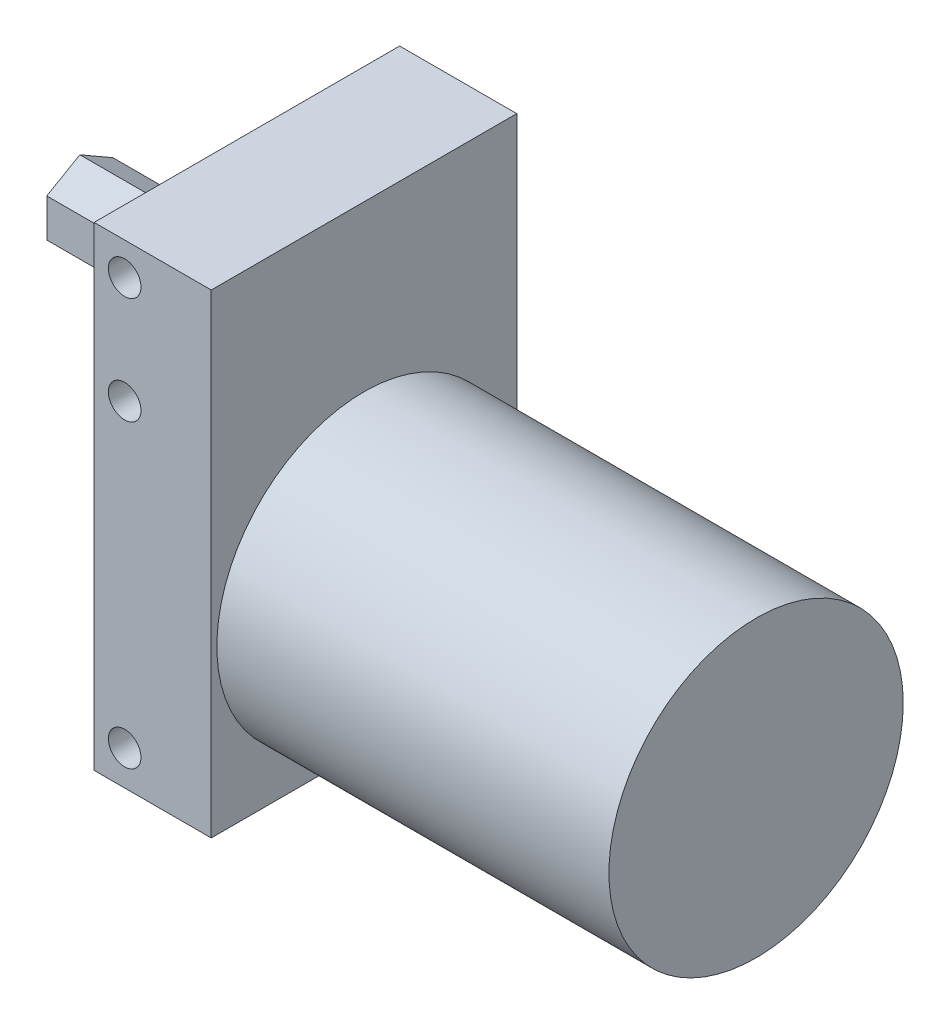
ISO-10303-21;
HEADER;
FILE_DESCRIPTION(('STEP AP214'),'2;1');
FILE_NAME('part.step','',(''),(''),'','','');
FILE_SCHEMA(('AUTOMOTIVE_DESIGN { 1 0 10303 214 1 1 1 1 }'));
ENDSEC;
DATA;
#1=APPLICATION_CONTEXT('core data for automotive mechanical design processes');
#2=APPLICATION_PROTOCOL_DEFINITION('international standard','automotive_design',2000,#1);
#3=PRODUCT_CONTEXT('',#1,'mechanical');
#4=PRODUCT('Part','Part','',(#3));
#5=PRODUCT_RELATED_PRODUCT_CATEGORY('part','',(#4));
#6=PRODUCT_DEFINITION_FORMATION('','',#4);
#7=PRODUCT_DEFINITION_CONTEXT('part definition',#1,'design');
#8=PRODUCT_DEFINITION('design','',#6,#7);
#9=PRODUCT_DEFINITION_SHAPE('','',#8);
#10=(LENGTH_UNIT() NAMED_UNIT(*) SI_UNIT(.MILLI.,.METRE.));
#11=(NAMED_UNIT(*) PLANE_ANGLE_UNIT() SI_UNIT($,.RADIAN.));
#12=(NAMED_UNIT(*) SI_UNIT($,.STERADIAN.) SOLID_ANGLE_UNIT());
#13=UNCERTAINTY_MEASURE_WITH_UNIT(LENGTH_MEASURE(1.E-05),#10,'distance_accuracy_value','');
#14=(GEOMETRIC_REPRESENTATION_CONTEXT(3) GLOBAL_UNCERTAINTY_ASSIGNED_CONTEXT((#13)) GLOBAL_UNIT_ASSIGNED_CONTEXT((#10,
#11,#12)) REPRESENTATION_CONTEXT('',''));
#15=CARTESIAN_POINT('',(0.,0.,0.));
#16=DIRECTION('',(0.,0.,1.));
#17=DIRECTION('',(1.,0.,0.));
#18=AXIS2_PLACEMENT_3D('',#15,#16,#17);
#19=CARTESIAN_POINT('',(-16.4,32.9,-15.));
#20=DIRECTION('',(1.,0.,0.));
#21=DIRECTION('',(0.,0.,-1.));
#22=AXIS2_PLACEMENT_3D('',#19,#20,#21);
#23=CYLINDRICAL_SURFACE('',#22,1.6);
#24=CARTESIAN_POINT('',(-16.4,32.9,-15.));
#25=DIRECTION('',(1.,0.,0.));
#26=DIRECTION('',(0.,0.,-1.));
#27=AXIS2_PLACEMENT_3D('',#24,#25,#26);
#28=CIRCLE('',#27,1.6);
#29=CARTESIAN_POINT('',(-16.4,32.9,-16.6));
#30=VERTEX_POINT('',#29);
#31=EDGE_CURVE('E154',#30,#30,#28,.T.);
#32=ORIENTED_EDGE('',*,*,#31,.F.);
#33=EDGE_LOOP('',(#32));
#34=FACE_BOUND('',#33,.T.);
#35=CARTESIAN_POINT('',(-10.4,32.9,-15.));
#36=DIRECTION('',(1.,0.,0.));
#37=DIRECTION('',(0.,0.,-1.));
#38=AXIS2_PLACEMENT_3D('',#35,#36,#37);
#39=CIRCLE('',#38,1.6);
#40=CARTESIAN_POINT('',(-10.4,32.9,-16.6));
#41=VERTEX_POINT('',#40);
#42=EDGE_CURVE('E47',#41,#41,#39,.F.);
#43=ORIENTED_EDGE('',*,*,#42,.F.);
#44=EDGE_LOOP('',(#43));
#45=FACE_BOUND('',#44,.T.);
#46=ADVANCED_FACE('F43',(#34,#45),#23,.F.);
#47=CARTESIAN_POINT('',(11.5,0.,0.));
#48=DIRECTION('',(0.,1.,0.));
#49=DIRECTION('',(0.,0.,1.));
#50=AXIS2_PLACEMENT_3D('',#47,#48,#49);
#51=PLANE('',#50);
#52=DIRECTION('',(0.,0.,-1.));
#53=VECTOR('',#52,1.);
#54=CARTESIAN_POINT('',(0.,0.,0.));
#55=LINE('',#54,#53);
#56=CARTESIAN_POINT('',(0.,0.,0.));
#57=VERTEX_POINT('',#56);
#58=CARTESIAN_POINT('',(0.,0.,-30.));
#59=VERTEX_POINT('',#58);
#60=EDGE_CURVE('E198',#57,#59,#55,.T.);
#61=ORIENTED_EDGE('',*,*,#60,.T.);
#62=DIRECTION('',(-1.,0.,0.));
#63=VECTOR('',#62,1.);
#64=CARTESIAN_POINT('',(11.5,0.,-30.));
#65=LINE('',#64,#63);
#66=CARTESIAN_POINT('',(11.5,0.,-30.));
#67=VERTEX_POINT('',#66);
#68=EDGE_CURVE('E222',#67,#59,#65,.T.);
#69=ORIENTED_EDGE('',*,*,#68,.F.);
#70=DIRECTION('',(0.,0.,-1.));
#71=VECTOR('',#70,1.);
#72=CARTESIAN_POINT('',(11.5,0.,0.));
#73=LINE('',#72,#71);
#74=CARTESIAN_POINT('',(11.5,0.,0.));
#75=VERTEX_POINT('',#74);
#76=EDGE_CURVE('E201',#75,#67,#73,.T.);
#77=ORIENTED_EDGE('',*,*,#76,.F.);
#78=DIRECTION('',(-1.,0.,0.));
#79=VECTOR('',#78,1.);
#80=CARTESIAN_POINT('',(11.5,0.,0.));
#81=LINE('',#80,#79);
#82=EDGE_CURVE('E61',#75,#57,#81,.T.);
#83=ORIENTED_EDGE('',*,*,#82,.T.);
#84=EDGE_LOOP('',(#61,#69,#77,#83));
#85=FACE_BOUND('',#84,.T.);
#86=ADVANCED_FACE('F45',(#85),#51,.F.);
#87=CARTESIAN_POINT('',(11.5,0.,-30.));
#88=DIRECTION('',(0.,0.,1.));
#89=DIRECTION('',(1.,0.,0.));
#90=AXIS2_PLACEMENT_3D('',#87,#88,#89);
#91=PLANE('',#90);
#92=CARTESIAN_POINT('',(3.2,43.4,-30.));
#93=DIRECTION('',(0.,0.,-1.));
#94=DIRECTION('',(-1.,0.,0.));
#95=AXIS2_PLACEMENT_3D('',#92,#93,#94);
#96=CIRCLE('',#95,1.6);
#97=CARTESIAN_POINT('',(1.6,43.4,-30.));
#98=VERTEX_POINT('',#97);
#99=EDGE_CURVE('E274',#98,#98,#96,.T.);
#100=ORIENTED_EDGE('',*,*,#99,.F.);
#101=EDGE_LOOP('',(#100));
#102=FACE_BOUND('',#101,.T.);
#103=CARTESIAN_POINT('',(3.2,32.9,-30.));
#104=DIRECTION('',(0.,0.,-1.));
#105=DIRECTION('',(-1.,0.,0.));
#106=AXIS2_PLACEMENT_3D('',#103,#104,#105);
#107=CIRCLE('',#106,1.6);
#108=CARTESIAN_POINT('',(1.6,32.9,-30.));
#109=VERTEX_POINT('',#108);
#110=EDGE_CURVE('E278',#109,#109,#107,.T.);
#111=ORIENTED_EDGE('',*,*,#110,.F.);
#112=EDGE_LOOP('',(#111));
#113=FACE_BOUND('',#112,.T.);
#114=CARTESIAN_POINT('',(3.2,3.4,-30.));
#115=DIRECTION('',(0.,0.,-1.));
#116=DIRECTION('',(-1.,0.,0.));
#117=AXIS2_PLACEMENT_3D('',#114,#115,#116);
#118=CIRCLE('',#117,1.6);
#119=CARTESIAN_POINT('',(1.6,3.4,-30.));
#120=VERTEX_POINT('',#119);
#121=EDGE_CURVE('E281',#120,#120,#118,.T.);
#122=ORIENTED_EDGE('',*,*,#121,.F.);
#123=EDGE_LOOP('',(#122));
#124=FACE_BOUND('',#123,.T.);
#125=DIRECTION('',(0.,1.,0.));
#126=VECTOR('',#125,1.);
#127=CARTESIAN_POINT('',(0.,0.,-30.));
#128=LINE('',#127,#126);
#129=CARTESIAN_POINT('',(0.,46.6,-30.));
#130=VERTEX_POINT('',#129);
#131=EDGE_CURVE('E211',#59,#130,#128,.T.);
#132=ORIENTED_EDGE('',*,*,#131,.T.);
#133=DIRECTION('',(-1.,0.,0.));
#134=VECTOR('',#133,1.);
#135=CARTESIAN_POINT('',(11.5,46.6,-30.));
#136=LINE('',#135,#134);
#137=CARTESIAN_POINT('',(11.5,46.6,-30.));
#138=VERTEX_POINT('',#137);
#139=EDGE_CURVE('E221',#138,#130,#136,.T.);
#140=ORIENTED_EDGE('',*,*,#139,.F.);
#141=DIRECTION('',(0.,1.,0.));
#142=VECTOR('',#141,1.);
#143=CARTESIAN_POINT('',(11.5,0.,-30.));
#144=LINE('',#143,#142);
#145=EDGE_CURVE('E88',#67,#138,#144,.T.);
#146=ORIENTED_EDGE('',*,*,#145,.F.);
#147=ORIENTED_EDGE('',*,*,#68,.T.);
#148=EDGE_LOOP('',(#132,#140,#146,#147));
#149=FACE_BOUND('',#148,.T.);
#150=ADVANCED_FACE('F237',(#102,#113,#124,#149),#91,.F.);
#151=CARTESIAN_POINT('',(11.5,46.6,0.));
#152=DIRECTION('',(0.,1.,0.));
#153=DIRECTION('',(0.,0.,1.));
#154=AXIS2_PLACEMENT_3D('',#151,#152,#153);
#155=PLANE('',#154);
#156=DIRECTION('',(0.,0.,-1.));
#157=VECTOR('',#156,1.);
#158=CARTESIAN_POINT('',(0.,46.6,0.));
#159=LINE('',#158,#157);
#160=CARTESIAN_POINT('',(0.,46.6,0.));
#161=VERTEX_POINT('',#160);
#162=EDGE_CURVE('E214',#161,#130,#159,.T.);
#163=ORIENTED_EDGE('',*,*,#162,.F.);
#164=DIRECTION('',(-1.,0.,0.));
#165=VECTOR('',#164,1.);
#166=CARTESIAN_POINT('',(11.5,46.6,0.));
#167=LINE('',#166,#165);
#168=CARTESIAN_POINT('',(11.5,46.6,0.));
#169=VERTEX_POINT('',#168);
#170=EDGE_CURVE('E76',#169,#161,#167,.T.);
#171=ORIENTED_EDGE('',*,*,#170,.F.);
#172=DIRECTION('',(0.,0.,-1.));
#173=VECTOR('',#172,1.);
#174=CARTESIAN_POINT('',(11.5,46.6,0.));
#175=LINE('',#174,#173);
#176=EDGE_CURVE('E205',#169,#138,#175,.T.);
#177=ORIENTED_EDGE('',*,*,#176,.T.);
#178=ORIENTED_EDGE('',*,*,#139,.T.);
#179=EDGE_LOOP('',(#163,#171,#177,#178));
#180=FACE_BOUND('',#179,.T.);
#181=ADVANCED_FACE('F261',(#180),#155,.T.);
#182=CARTESIAN_POINT('',(11.5,0.,0.));
#183=DIRECTION('',(0.,0.,1.));
#184=DIRECTION('',(1.,0.,0.));
#185=AXIS2_PLACEMENT_3D('',#182,#183,#184);
#186=PLANE('',#185);
#187=CARTESIAN_POINT('',(3.,43.4,0.));
#188=DIRECTION('',(0.,0.,1.));
#189=DIRECTION('',(1.,0.,0.));
#190=AXIS2_PLACEMENT_3D('',#187,#188,#189);
#191=CIRCLE('',#190,1.6);
#192=CARTESIAN_POINT('',(4.6,43.4,0.));
#193=VERTEX_POINT('',#192);
#194=EDGE_CURVE('E299',#193,#193,#191,.T.);
#195=ORIENTED_EDGE('',*,*,#194,.F.);
#196=EDGE_LOOP('',(#195));
#197=FACE_BOUND('',#196,.T.);
#198=CARTESIAN_POINT('',(3.,32.9,0.));
#199=DIRECTION('',(0.,0.,1.));
#200=DIRECTION('',(1.,0.,0.));
#201=AXIS2_PLACEMENT_3D('',#198,#199,#200);
#202=CIRCLE('',#201,1.6);
#203=CARTESIAN_POINT('',(4.6,32.9,0.));
#204=VERTEX_POINT('',#203);
#205=EDGE_CURVE('E302',#204,#204,#202,.T.);
#206=ORIENTED_EDGE('',*,*,#205,.F.);
#207=EDGE_LOOP('',(#206));
#208=FACE_BOUND('',#207,.T.);
#209=CARTESIAN_POINT('',(3.,3.4,0.));
#210=DIRECTION('',(0.,0.,1.));
#211=DIRECTION('',(1.,0.,0.));
#212=AXIS2_PLACEMENT_3D('',#209,#210,#211);
#213=CIRCLE('',#212,1.6);
#214=CARTESIAN_POINT('',(4.6,3.4,0.));
#215=VERTEX_POINT('',#214);
#216=EDGE_CURVE('E308',#215,#215,#213,.T.);
#217=ORIENTED_EDGE('',*,*,#216,.F.);
#218=EDGE_LOOP('',(#217));
#219=FACE_BOUND('',#218,.T.);
#220=DIRECTION('',(0.,1.,0.));
#221=VECTOR('',#220,1.);
#222=CARTESIAN_POINT('',(0.,0.,0.));
#223=LINE('',#222,#221);
#224=EDGE_CURVE('E203',#57,#161,#223,.T.);
#225=ORIENTED_EDGE('',*,*,#224,.F.);
#226=ORIENTED_EDGE('',*,*,#82,.F.);
#227=DIRECTION('',(0.,1.,0.));
#228=VECTOR('',#227,1.);
#229=CARTESIAN_POINT('',(11.5,0.,0.));
#230=LINE('',#229,#228);
#231=EDGE_CURVE('E208',#75,#169,#230,.T.);
#232=ORIENTED_EDGE('',*,*,#231,.T.);
#233=ORIENTED_EDGE('',*,*,#170,.T.);
#234=EDGE_LOOP('',(#225,#226,#232,#233));
#235=FACE_BOUND('',#234,.T.);
#236=ADVANCED_FACE('F254',(#197,#208,#219,#235),#186,.T.);
#237=CARTESIAN_POINT('',(11.5,0.,0.));
#238=DIRECTION('',(1.,0.,0.));
#239=DIRECTION('',(0.,0.,-1.));
#240=AXIS2_PLACEMENT_3D('',#237,#238,#239);
#241=PLANE('',#240);
#242=CARTESIAN_POINT('',(11.5,16.,-15.));
#243=DIRECTION('',(1.,0.,0.));
#244=DIRECTION('',(0.,0.,-1.));
#245=AXIS2_PLACEMENT_3D('',#242,#243,#244);
#246=CIRCLE('',#245,14.45);
#247=CARTESIAN_POINT('',(11.5,16.,-29.45));
#248=VERTEX_POINT('',#247);
#249=EDGE_CURVE('E11',#248,#248,#246,.T.);
#250=ORIENTED_EDGE('',*,*,#249,.F.);
#251=EDGE_LOOP('',(#250));
#252=FACE_BOUND('',#251,.T.);
#253=ORIENTED_EDGE('',*,*,#76,.T.);
#254=ORIENTED_EDGE('',*,*,#145,.T.);
#255=ORIENTED_EDGE('',*,*,#176,.F.);
#256=ORIENTED_EDGE('',*,*,#231,.F.);
#257=EDGE_LOOP('',(#253,#254,#255,#256));
#258=FACE_BOUND('',#257,.T.);
#259=ADVANCED_FACE('F251',(#252,#258),#241,.T.);
#260=CARTESIAN_POINT('',(0.,0.,0.));
#261=DIRECTION('',(1.,0.,0.));
#262=DIRECTION('',(0.,0.,-1.));
#263=AXIS2_PLACEMENT_3D('',#260,#261,#262);
#264=PLANE('',#263);
#265=CARTESIAN_POINT('',(0.,32.9,-15.));
#266=DIRECTION('',(1.,0.,0.));
#267=DIRECTION('',(0.,0.,-1.));
#268=AXIS2_PLACEMENT_3D('',#265,#266,#267);
#269=CIRCLE('',#268,7.);
#270=CARTESIAN_POINT('',(0.,32.9,-22.));
#271=VERTEX_POINT('',#270);
#272=EDGE_CURVE('E169',#271,#271,#269,.T.);
#273=ORIENTED_EDGE('',*,*,#272,.T.);
#274=EDGE_LOOP('',(#273));
#275=FACE_BOUND('',#274,.T.);
#276=ORIENTED_EDGE('',*,*,#60,.F.);
#277=ORIENTED_EDGE('',*,*,#224,.T.);
#278=ORIENTED_EDGE('',*,*,#162,.T.);
#279=ORIENTED_EDGE('',*,*,#131,.F.);
#280=EDGE_LOOP('',(#276,#277,#278,#279));
#281=FACE_BOUND('',#280,.T.);
#282=ADVANCED_FACE('F249',(#275,#281),#264,.F.);
#283=CARTESIAN_POINT('',(-2.5,32.9,-15.));
#284=DIRECTION('',(1.,0.,0.));
#285=DIRECTION('',(0.,0.,-1.));
#286=AXIS2_PLACEMENT_3D('',#283,#284,#285);
#287=CYLINDRICAL_SURFACE('',#286,7.);
#288=CARTESIAN_POINT('',(-2.5,32.9,-15.));
#289=DIRECTION('',(1.,0.,0.));
#290=DIRECTION('',(0.,0.,-1.));
#291=AXIS2_PLACEMENT_3D('',#288,#289,#290);
#292=CIRCLE('',#291,7.);
#293=CARTESIAN_POINT('',(-2.5,32.9,-22.));
#294=VERTEX_POINT('',#293);
#295=EDGE_CURVE('E195',#294,#294,#292,.T.);
#296=ORIENTED_EDGE('',*,*,#295,.T.);
#297=EDGE_LOOP('',(#296));
#298=FACE_BOUND('',#297,.T.);
#299=ORIENTED_EDGE('',*,*,#272,.F.);
#300=EDGE_LOOP('',(#299));
#301=FACE_BOUND('',#300,.T.);
#302=ADVANCED_FACE('F245',(#298,#301),#287,.T.);
#303=CARTESIAN_POINT('',(-2.5,0.,0.));
#304=DIRECTION('',(1.,0.,0.));
#305=DIRECTION('',(0.,0.,-1.));
#306=AXIS2_PLACEMENT_3D('',#303,#304,#305);
#307=PLANE('',#306);
#308=DIRECTION('',(0.,1.,0.));
#309=VECTOR('',#308,1.);
#310=CARTESIAN_POINT('',(-2.5,0.,-18.25));
#311=LINE('',#310,#309);
#312=CARTESIAN_POINT('',(-2.5,31.0236116251337,-18.25));
#313=VERTEX_POINT('',#312);
#314=CARTESIAN_POINT('',(-2.5,34.7763883748663,-18.25));
#315=VERTEX_POINT('',#314);
#316=EDGE_CURVE('E133',#313,#315,#311,.T.);
#317=ORIENTED_EDGE('',*,*,#316,.T.);
#318=DIRECTION('',(0.,0.5,0.866025403784438));
#319=VECTOR('',#318,1.);
#320=CARTESIAN_POINT('',(-2.5,33.9847730906827,-19.621117892254));
#321=LINE('',#320,#319);
#322=CARTESIAN_POINT('',(-2.5,36.6527767497326,-15.));
#323=VERTEX_POINT('',#322);
#324=EDGE_CURVE('E192',#315,#323,#321,.T.);
#325=ORIENTED_EDGE('',*,*,#324,.T.);
#326=DIRECTION('',(0.,-0.500000000000001,0.866025403784438));
#327=VECTOR('',#326,1.);
#328=CARTESIAN_POINT('',(-2.5,20.9943920339161,12.121117892254));
#329=LINE('',#328,#327);
#330=CARTESIAN_POINT('',(-2.5,34.7763883748663,-11.75));
#331=VERTEX_POINT('',#330);
#332=EDGE_CURVE('E189',#323,#331,#329,.T.);
#333=ORIENTED_EDGE('',*,*,#332,.T.);
#334=DIRECTION('',(0.,-1.,0.));
#335=VECTOR('',#334,1.);
#336=CARTESIAN_POINT('',(-2.5,0.,-11.75));
#337=LINE('',#336,#335);
#338=CARTESIAN_POINT('',(-2.5,31.0236116251337,-11.75));
#339=VERTEX_POINT('',#338);
#340=EDGE_CURVE('E186',#331,#339,#337,.T.);
#341=ORIENTED_EDGE('',*,*,#340,.T.);
#342=DIRECTION('',(0.,-0.5,-0.866025403784439));
#343=VECTOR('',#342,1.);
#344=CARTESIAN_POINT('',(-2.5,28.3556079660839,-16.371117892254));
#345=LINE('',#344,#343);
#346=CARTESIAN_POINT('',(-2.5,29.1472232502674,-15.));
#347=VERTEX_POINT('',#346);
#348=EDGE_CURVE('E183',#339,#347,#345,.T.);
#349=ORIENTED_EDGE('',*,*,#348,.T.);
#350=DIRECTION('',(0.,0.5,-0.866025403784438));
#351=VECTOR('',#350,1.);
#352=CARTESIAN_POINT('',(-2.5,15.3652269093173,8.87111789225402));
#353=LINE('',#352,#351);
#354=EDGE_CURVE('E181',#347,#313,#353,.T.);
#355=ORIENTED_EDGE('',*,*,#354,.T.);
#356=EDGE_LOOP('',(#317,#325,#333,#341,#349,#355));
#357=FACE_BOUND('',#356,.T.);
#358=ORIENTED_EDGE('',*,*,#295,.F.);
#359=EDGE_LOOP('',(#358));
#360=FACE_BOUND('',#359,.T.);
#361=ADVANCED_FACE('F242',(#357,#360),#307,.F.);
#362=CARTESIAN_POINT('',(-16.4,15.3652269093173,8.87111789225402));
#363=DIRECTION('',(0.,-0.866025403784438,-0.5));
#364=DIRECTION('',(0.,0.5,-0.866025403784438));
#365=AXIS2_PLACEMENT_3D('',#362,#363,#364);
#366=PLANE('',#365);
#367=ORIENTED_EDGE('',*,*,#354,.F.);
#368=DIRECTION('',(1.,0.,0.));
#369=VECTOR('',#368,1.);
#370=CARTESIAN_POINT('',(-16.4,29.1472232502674,-15.));
#371=LINE('',#370,#369);
#372=CARTESIAN_POINT('',(-16.4,29.1472232502674,-15.));
#373=VERTEX_POINT('',#372);
#374=EDGE_CURVE('E153',#373,#347,#371,.T.);
#375=ORIENTED_EDGE('',*,*,#374,.F.);
#376=DIRECTION('',(0.,0.5,-0.866025403784438));
#377=VECTOR('',#376,1.);
#378=CARTESIAN_POINT('',(-16.4,15.3652269093173,8.87111789225402));
#379=LINE('',#378,#377);
#380=CARTESIAN_POINT('',(-16.4,31.0236116251337,-18.25));
#381=VERTEX_POINT('',#380);
#382=EDGE_CURVE('E145',#373,#381,#379,.T.);
#383=ORIENTED_EDGE('',*,*,#382,.T.);
#384=DIRECTION('',(1.,0.,0.));
#385=VECTOR('',#384,1.);
#386=CARTESIAN_POINT('',(-16.4,31.0236116251337,-18.25));
#387=LINE('',#386,#385);
#388=EDGE_CURVE('E128',#381,#313,#387,.T.);
#389=ORIENTED_EDGE('',*,*,#388,.T.);
#390=EDGE_LOOP('',(#367,#375,#383,#389));
#391=FACE_BOUND('',#390,.T.);
#392=ADVANCED_FACE('F151',(#391),#366,.T.);
#393=CARTESIAN_POINT('',(-16.4,28.3556079660839,-16.371117892254));
#394=DIRECTION('',(0.,-0.866025403784439,0.5));
#395=DIRECTION('',(0.,-0.5,-0.866025403784439));
#396=AXIS2_PLACEMENT_3D('',#393,#394,#395);
#397=PLANE('',#396);
#398=ORIENTED_EDGE('',*,*,#348,.F.);
#399=DIRECTION('',(1.,0.,0.));
#400=VECTOR('',#399,1.);
#401=CARTESIAN_POINT('',(-16.4,31.0236116251337,-11.75));
#402=LINE('',#401,#400);
#403=CARTESIAN_POINT('',(-16.4,31.0236116251337,-11.75));
#404=VERTEX_POINT('',#403);
#405=EDGE_CURVE('E170',#404,#339,#402,.T.);
#406=ORIENTED_EDGE('',*,*,#405,.F.);
#407=DIRECTION('',(0.,-0.5,-0.866025403784439));
#408=VECTOR('',#407,1.);
#409=CARTESIAN_POINT('',(-16.4,28.3556079660839,-16.371117892254));
#410=LINE('',#409,#408);
#411=EDGE_CURVE('E138',#404,#373,#410,.T.);
#412=ORIENTED_EDGE('',*,*,#411,.T.);
#413=ORIENTED_EDGE('',*,*,#374,.T.);
#414=EDGE_LOOP('',(#398,#406,#412,#413));
#415=FACE_BOUND('',#414,.T.);
#416=ADVANCED_FACE('F335',(#415),#397,.T.);
#417=CARTESIAN_POINT('',(-16.4,0.,-11.75));
#418=DIRECTION('',(0.,0.,1.));
#419=DIRECTION('',(1.,0.,0.));
#420=AXIS2_PLACEMENT_3D('',#417,#418,#419);
#421=PLANE('',#420);
#422=ORIENTED_EDGE('',*,*,#340,.F.);
#423=DIRECTION('',(1.,0.,0.));
#424=VECTOR('',#423,1.);
#425=CARTESIAN_POINT('',(-16.4,34.7763883748663,-11.75));
#426=LINE('',#425,#424);
#427=CARTESIAN_POINT('',(-16.4,34.7763883748663,-11.75));
#428=VERTEX_POINT('',#427);
#429=EDGE_CURVE('E173',#428,#331,#426,.T.);
#430=ORIENTED_EDGE('',*,*,#429,.F.);
#431=DIRECTION('',(0.,-1.,0.));
#432=VECTOR('',#431,1.);
#433=CARTESIAN_POINT('',(-16.4,0.,-11.75));
#434=LINE('',#433,#432);
#435=EDGE_CURVE('E164',#428,#404,#434,.T.);
#436=ORIENTED_EDGE('',*,*,#435,.T.);
#437=ORIENTED_EDGE('',*,*,#405,.T.);
#438=EDGE_LOOP('',(#422,#430,#436,#437));
#439=FACE_BOUND('',#438,.T.);
#440=ADVANCED_FACE('F338',(#439),#421,.T.);
#441=CARTESIAN_POINT('',(-16.4,20.9943920339161,12.121117892254));
#442=DIRECTION('',(0.,0.866025403784438,0.500000000000001));
#443=DIRECTION('',(0.,-0.500000000000001,0.866025403784438));
#444=AXIS2_PLACEMENT_3D('',#441,#442,#443);
#445=PLANE('',#444);
#446=ORIENTED_EDGE('',*,*,#332,.F.);
#447=DIRECTION('',(1.,0.,0.));
#448=VECTOR('',#447,1.);
#449=CARTESIAN_POINT('',(-16.4,36.6527767497326,-15.));
#450=LINE('',#449,#448);
#451=CARTESIAN_POINT('',(-16.4,36.6527767497326,-15.));
#452=VERTEX_POINT('',#451);
#453=EDGE_CURVE('E176',#452,#323,#450,.T.);
#454=ORIENTED_EDGE('',*,*,#453,.F.);
#455=DIRECTION('',(0.,-0.500000000000001,0.866025403784438));
#456=VECTOR('',#455,1.);
#457=CARTESIAN_POINT('',(-16.4,20.9943920339161,12.121117892254));
#458=LINE('',#457,#456);
#459=EDGE_CURVE('E161',#452,#428,#458,.T.);
#460=ORIENTED_EDGE('',*,*,#459,.T.);
#461=ORIENTED_EDGE('',*,*,#429,.T.);
#462=EDGE_LOOP('',(#446,#454,#460,#461));
#463=FACE_BOUND('',#462,.T.);
#464=ADVANCED_FACE('F342',(#463),#445,.T.);
#465=CARTESIAN_POINT('',(-16.4,33.9847730906827,-19.621117892254));
#466=DIRECTION('',(0.,0.866025403784438,-0.5));
#467=DIRECTION('',(0.,0.5,0.866025403784438));
#468=AXIS2_PLACEMENT_3D('',#465,#466,#467);
#469=PLANE('',#468);
#470=ORIENTED_EDGE('',*,*,#324,.F.);
#471=DIRECTION('',(1.,0.,0.));
#472=VECTOR('',#471,1.);
#473=CARTESIAN_POINT('',(-16.4,34.7763883748663,-18.25));
#474=LINE('',#473,#472);
#475=CARTESIAN_POINT('',(-16.4,34.7763883748663,-18.25));
#476=VERTEX_POINT('',#475);
#477=EDGE_CURVE('E137',#476,#315,#474,.T.);
#478=ORIENTED_EDGE('',*,*,#477,.F.);
#479=DIRECTION('',(0.,0.5,0.866025403784438));
#480=VECTOR('',#479,1.);
#481=CARTESIAN_POINT('',(-16.4,33.9847730906827,-19.621117892254));
#482=LINE('',#481,#480);
#483=EDGE_CURVE('E149',#476,#452,#482,.T.);
#484=ORIENTED_EDGE('',*,*,#483,.T.);
#485=ORIENTED_EDGE('',*,*,#453,.T.);
#486=EDGE_LOOP('',(#470,#478,#484,#485));
#487=FACE_BOUND('',#486,.T.);
#488=ADVANCED_FACE('F346',(#487),#469,.T.);
#489=CARTESIAN_POINT('',(-16.4,0.,-18.25));
#490=DIRECTION('',(0.,0.,-1.));
#491=DIRECTION('',(-1.,0.,0.));
#492=AXIS2_PLACEMENT_3D('',#489,#490,#491);
#493=PLANE('',#492);
#494=ORIENTED_EDGE('',*,*,#316,.F.);
#495=ORIENTED_EDGE('',*,*,#388,.F.);
#496=DIRECTION('',(0.,1.,0.));
#497=VECTOR('',#496,1.);
#498=CARTESIAN_POINT('',(-16.4,0.,-18.25));
#499=LINE('',#498,#497);
#500=EDGE_CURVE('E131',#381,#476,#499,.T.);
#501=ORIENTED_EDGE('',*,*,#500,.T.);
#502=ORIENTED_EDGE('',*,*,#477,.T.);
#503=EDGE_LOOP('',(#494,#495,#501,#502));
#504=FACE_BOUND('',#503,.T.);
#505=ADVANCED_FACE('F130',(#504),#493,.T.);
#506=CARTESIAN_POINT('',(-16.4,0.,0.));
#507=DIRECTION('',(1.,0.,0.));
#508=DIRECTION('',(0.,0.,-1.));
#509=AXIS2_PLACEMENT_3D('',#506,#507,#508);
#510=PLANE('',#509);
#511=ORIENTED_EDGE('',*,*,#31,.T.);
#512=EDGE_LOOP('',(#511));
#513=FACE_BOUND('',#512,.T.);
#514=ORIENTED_EDGE('',*,*,#382,.F.);
#515=ORIENTED_EDGE('',*,*,#411,.F.);
#516=ORIENTED_EDGE('',*,*,#435,.F.);
#517=ORIENTED_EDGE('',*,*,#459,.F.);
#518=ORIENTED_EDGE('',*,*,#483,.F.);
#519=ORIENTED_EDGE('',*,*,#500,.F.);
#520=EDGE_LOOP('',(#514,#515,#516,#517,#518,#519));
#521=FACE_BOUND('',#520,.T.);
#522=ADVANCED_FACE('F143',(#513,#521),#510,.F.);
#523=CARTESIAN_POINT('',(-10.4,0.,0.));
#524=DIRECTION('',(1.,0.,0.));
#525=DIRECTION('',(0.,0.,-1.));
#526=AXIS2_PLACEMENT_3D('',#523,#524,#525);
#527=PLANE('',#526);
#528=ORIENTED_EDGE('',*,*,#42,.T.);
#529=EDGE_LOOP('',(#528));
#530=FACE_BOUND('',#529,.T.);
#531=ADVANCED_FACE('F227',(#530),#527,.F.);
#532=CARTESIAN_POINT('',(50.,16.,-15.));
#533=DIRECTION('',(-1.,0.,0.));
#534=DIRECTION('',(0.,0.,1.));
#535=AXIS2_PLACEMENT_3D('',#532,#533,#534);
#536=CYLINDRICAL_SURFACE('',#535,14.45);
#537=CARTESIAN_POINT('',(50.,16.,-15.));
#538=DIRECTION('',(1.,0.,0.));
#539=DIRECTION('',(0.,0.,-1.));
#540=AXIS2_PLACEMENT_3D('',#537,#538,#539);
#541=CIRCLE('',#540,14.45);
#542=CARTESIAN_POINT('',(50.,16.,-29.45));
#543=VERTEX_POINT('',#542);
#544=EDGE_CURVE('E157',#543,#543,#541,.T.);
#545=ORIENTED_EDGE('',*,*,#544,.F.);
#546=EDGE_LOOP('',(#545));
#547=FACE_BOUND('',#546,.T.);
#548=ORIENTED_EDGE('',*,*,#249,.T.);
#549=EDGE_LOOP('',(#548));
#550=FACE_BOUND('',#549,.T.);
#551=ADVANCED_FACE('F320',(#547,#550),#536,.T.);
#552=CARTESIAN_POINT('',(50.,16.,-15.));
#553=DIRECTION('',(1.,0.,0.));
#554=DIRECTION('',(0.,0.,-1.));
#555=AXIS2_PLACEMENT_3D('',#552,#553,#554);
#556=PLANE('',#555);
#557=ORIENTED_EDGE('',*,*,#544,.T.);
#558=EDGE_LOOP('',(#557));
#559=FACE_BOUND('',#558,.T.);
#560=ADVANCED_FACE('F318',(#559),#556,.T.);
#561=CARTESIAN_POINT('',(3.,3.4,-6.));
#562=DIRECTION('',(0.,0.,1.));
#563=DIRECTION('',(1.,0.,0.));
#564=AXIS2_PLACEMENT_3D('',#561,#562,#563);
#565=CYLINDRICAL_SURFACE('',#564,1.6);
#566=CARTESIAN_POINT('',(3.,3.4,-6.));
#567=DIRECTION('',(0.,0.,1.));
#568=DIRECTION('',(1.,0.,0.));
#569=AXIS2_PLACEMENT_3D('',#566,#567,#568);
#570=CIRCLE('',#569,1.6);
#571=CARTESIAN_POINT('',(4.6,3.4,-6.));
#572=VERTEX_POINT('',#571);
#573=EDGE_CURVE('E311',#572,#572,#570,.T.);
#574=ORIENTED_EDGE('',*,*,#573,.F.);
#575=EDGE_LOOP('',(#574));
#576=FACE_BOUND('',#575,.T.);
#577=ORIENTED_EDGE('',*,*,#216,.T.);
#578=EDGE_LOOP('',(#577));
#579=FACE_BOUND('',#578,.T.);
#580=ADVANCED_FACE('F328',(#576,#579),#565,.F.);
#581=CARTESIAN_POINT('',(3.,3.4,-6.));
#582=DIRECTION('',(0.,0.,1.));
#583=DIRECTION('',(1.,0.,0.));
#584=AXIS2_PLACEMENT_3D('',#581,#582,#583);
#585=PLANE('',#584);
#586=ORIENTED_EDGE('',*,*,#573,.T.);
#587=EDGE_LOOP('',(#586));
#588=FACE_BOUND('',#587,.T.);
#589=ADVANCED_FACE('F390',(#588),#585,.T.);
#590=CARTESIAN_POINT('',(3.,32.9,-6.));
#591=DIRECTION('',(0.,0.,1.));
#592=DIRECTION('',(1.,0.,0.));
#593=AXIS2_PLACEMENT_3D('',#590,#591,#592);
#594=CYLINDRICAL_SURFACE('',#593,1.6);
#595=CARTESIAN_POINT('',(3.,32.9,-6.));
#596=DIRECTION('',(0.,0.,1.));
#597=DIRECTION('',(1.,0.,0.));
#598=AXIS2_PLACEMENT_3D('',#595,#596,#597);
#599=CIRCLE('',#598,1.6);
#600=CARTESIAN_POINT('',(4.6,32.9,-6.));
#601=VERTEX_POINT('',#600);
#602=EDGE_CURVE('E305',#601,#601,#599,.T.);
#603=ORIENTED_EDGE('',*,*,#602,.F.);
#604=EDGE_LOOP('',(#603));
#605=FACE_BOUND('',#604,.T.);
#606=ORIENTED_EDGE('',*,*,#205,.T.);
#607=EDGE_LOOP('',(#606));
#608=FACE_BOUND('',#607,.T.);
#609=ADVANCED_FACE('F400',(#605,#608),#594,.F.);
#610=CARTESIAN_POINT('',(3.,32.9,-6.));
#611=DIRECTION('',(0.,0.,1.));
#612=DIRECTION('',(1.,0.,0.));
#613=AXIS2_PLACEMENT_3D('',#610,#611,#612);
#614=PLANE('',#613);
#615=ORIENTED_EDGE('',*,*,#602,.T.);
#616=EDGE_LOOP('',(#615));
#617=FACE_BOUND('',#616,.T.);
#618=ADVANCED_FACE('F409',(#617),#614,.T.);
#619=CARTESIAN_POINT('',(3.,43.4,-6.));
#620=DIRECTION('',(0.,0.,1.));
#621=DIRECTION('',(1.,0.,0.));
#622=AXIS2_PLACEMENT_3D('',#619,#620,#621);
#623=CYLINDRICAL_SURFACE('',#622,1.6);
#624=CARTESIAN_POINT('',(3.,43.4,-6.));
#625=DIRECTION('',(0.,0.,1.));
#626=DIRECTION('',(1.,0.,0.));
#627=AXIS2_PLACEMENT_3D('',#624,#625,#626);
#628=CIRCLE('',#627,1.6);
#629=CARTESIAN_POINT('',(4.6,43.4,-6.));
#630=VERTEX_POINT('',#629);
#631=EDGE_CURVE('E296',#630,#630,#628,.T.);
#632=ORIENTED_EDGE('',*,*,#631,.F.);
#633=EDGE_LOOP('',(#632));
#634=FACE_BOUND('',#633,.T.);
#635=ORIENTED_EDGE('',*,*,#194,.T.);
#636=EDGE_LOOP('',(#635));
#637=FACE_BOUND('',#636,.T.);
#638=ADVANCED_FACE('F419',(#634,#637),#623,.F.);
#639=CARTESIAN_POINT('',(3.,43.4,-6.));
#640=DIRECTION('',(0.,0.,1.));
#641=DIRECTION('',(1.,0.,0.));
#642=AXIS2_PLACEMENT_3D('',#639,#640,#641);
#643=PLANE('',#642);
#644=ORIENTED_EDGE('',*,*,#631,.T.);
#645=EDGE_LOOP('',(#644));
#646=FACE_BOUND('',#645,.T.);
#647=ADVANCED_FACE('F429',(#646),#643,.T.);
#648=CARTESIAN_POINT('',(3.2,3.4,-27.));
#649=DIRECTION('',(0.,0.,-1.));
#650=DIRECTION('',(-1.,0.,0.));
#651=AXIS2_PLACEMENT_3D('',#648,#649,#650);
#652=CYLINDRICAL_SURFACE('',#651,1.6);
#653=CARTESIAN_POINT('',(3.2,3.4,-27.));
#654=DIRECTION('',(0.,0.,-1.));
#655=DIRECTION('',(-1.,0.,0.));
#656=AXIS2_PLACEMENT_3D('',#653,#654,#655);
#657=CIRCLE('',#656,1.6);
#658=CARTESIAN_POINT('',(1.6,3.4,-27.));
#659=VERTEX_POINT('',#658);
#660=EDGE_CURVE('E288',#659,#659,#657,.T.);
#661=ORIENTED_EDGE('',*,*,#660,.F.);
#662=EDGE_LOOP('',(#661));
#663=FACE_BOUND('',#662,.T.);
#664=ORIENTED_EDGE('',*,*,#121,.T.);
#665=EDGE_LOOP('',(#664));
#666=FACE_BOUND('',#665,.T.);
#667=ADVANCED_FACE('F438',(#663,#666),#652,.F.);
#668=CARTESIAN_POINT('',(3.2,3.4,-27.));
#669=DIRECTION('',(0.,0.,-1.));
#670=DIRECTION('',(-1.,0.,0.));
#671=AXIS2_PLACEMENT_3D('',#668,#669,#670);
#672=PLANE('',#671);
#673=ORIENTED_EDGE('',*,*,#660,.T.);
#674=EDGE_LOOP('',(#673));
#675=FACE_BOUND('',#674,.T.);
#676=ADVANCED_FACE('F447',(#675),#672,.T.);
#677=CARTESIAN_POINT('',(3.2,32.9,-27.));
#678=DIRECTION('',(0.,0.,-1.));
#679=DIRECTION('',(-1.,0.,0.));
#680=AXIS2_PLACEMENT_3D('',#677,#678,#679);
#681=CYLINDRICAL_SURFACE('',#680,1.6);
#682=CARTESIAN_POINT('',(3.2,32.9,-27.));
#683=DIRECTION('',(0.,0.,-1.));
#684=DIRECTION('',(-1.,0.,0.));
#685=AXIS2_PLACEMENT_3D('',#682,#683,#684);
#686=CIRCLE('',#685,1.6);
#687=CARTESIAN_POINT('',(1.6,32.9,-27.));
#688=VERTEX_POINT('',#687);
#689=EDGE_CURVE('E287',#688,#688,#686,.T.);
#690=ORIENTED_EDGE('',*,*,#689,.F.);
#691=EDGE_LOOP('',(#690));
#692=FACE_BOUND('',#691,.T.);
#693=ORIENTED_EDGE('',*,*,#110,.T.);
#694=EDGE_LOOP('',(#693));
#695=FACE_BOUND('',#694,.T.);
#696=ADVANCED_FACE('F457',(#692,#695),#681,.F.);
#697=CARTESIAN_POINT('',(3.2,32.9,-27.));
#698=DIRECTION('',(0.,0.,-1.));
#699=DIRECTION('',(-1.,0.,0.));
#700=AXIS2_PLACEMENT_3D('',#697,#698,#699);
#701=PLANE('',#700);
#702=ORIENTED_EDGE('',*,*,#689,.T.);
#703=EDGE_LOOP('',(#702));
#704=FACE_BOUND('',#703,.T.);
#705=ADVANCED_FACE('F467',(#704),#701,.T.);
#706=CARTESIAN_POINT('',(3.2,43.4,-27.));
#707=DIRECTION('',(0.,0.,-1.));
#708=DIRECTION('',(-1.,0.,0.));
#709=AXIS2_PLACEMENT_3D('',#706,#707,#708);
#710=CYLINDRICAL_SURFACE('',#709,1.6);
#711=CARTESIAN_POINT('',(3.2,43.4,-27.));
#712=DIRECTION('',(0.,0.,-1.));
#713=DIRECTION('',(-1.,0.,0.));
#714=AXIS2_PLACEMENT_3D('',#711,#712,#713);
#715=CIRCLE('',#714,1.6);
#716=CARTESIAN_POINT('',(1.6,43.4,-27.));
#717=VERTEX_POINT('',#716);
#718=EDGE_CURVE('E314',#717,#717,#715,.T.);
#719=ORIENTED_EDGE('',*,*,#718,.F.);
#720=EDGE_LOOP('',(#719));
#721=FACE_BOUND('',#720,.T.);
#722=ORIENTED_EDGE('',*,*,#99,.T.);
#723=EDGE_LOOP('',(#722));
#724=FACE_BOUND('',#723,.T.);
#725=ADVANCED_FACE('F477',(#721,#724),#710,.F.);
#726=CARTESIAN_POINT('',(3.2,43.4,-27.));
#727=DIRECTION('',(0.,0.,-1.));
#728=DIRECTION('',(-1.,0.,0.));
#729=AXIS2_PLACEMENT_3D('',#726,#727,#728);
#730=PLANE('',#729);
#731=ORIENTED_EDGE('',*,*,#718,.T.);
#732=EDGE_LOOP('',(#731));
#733=FACE_BOUND('',#732,.T.);
#734=ADVANCED_FACE('F487',(#733),#730,.T.);
#735=CLOSED_SHELL('',(#46,#86,#150,#181,#236,#259,#282,#302,#361,#392,#416,#440,#464,#488,#505,
#522,#531,#551,#560,#580,#589,#609,#618,#638,#647,#667,#676,#696,#705,#725,#734));
#736=MANIFOLD_SOLID_BREP('B2',#735);
#737=ADVANCED_BREP_SHAPE_REPRESENTATION('',(#18,#736),#14);
#738=SHAPE_DEFINITION_REPRESENTATION(#9,#737);
ENDSEC;
END-ISO-10303-21;
